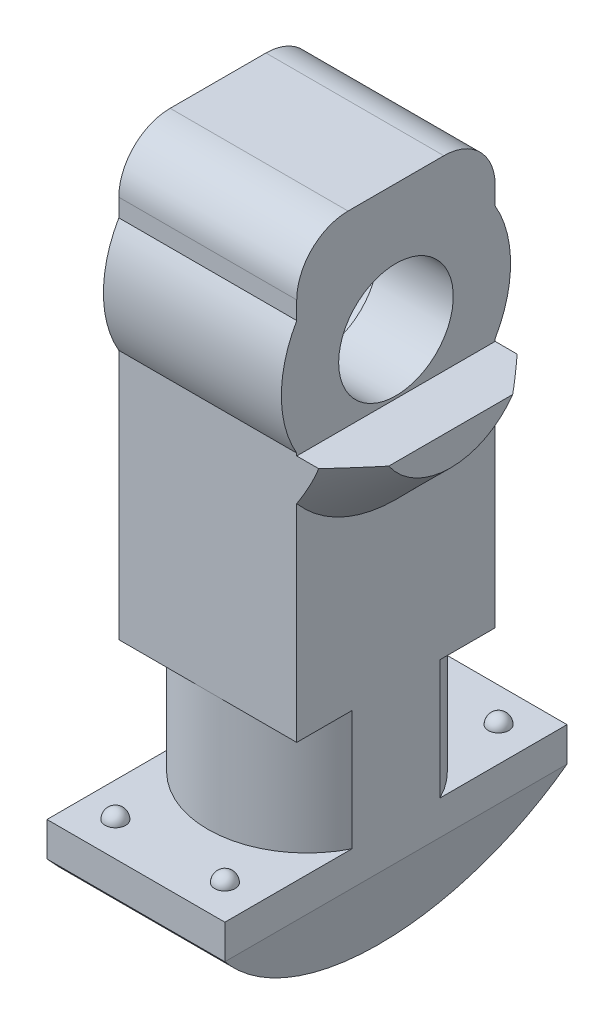
ISO-10303-21;
HEADER;
FILE_DESCRIPTION(('STEP AP214'),'2;1');
FILE_NAME('part.step','',(''),(''),'','','');
FILE_SCHEMA(('AUTOMOTIVE_DESIGN { 1 0 10303 214 1 1 1 1 }'));
ENDSEC;
DATA;
#1=APPLICATION_CONTEXT('core data for automotive mechanical design processes');
#2=APPLICATION_PROTOCOL_DEFINITION('international standard','automotive_design',2000,#1);
#3=PRODUCT_CONTEXT('',#1,'mechanical');
#4=PRODUCT('Part','Part','',(#3));
#5=PRODUCT_RELATED_PRODUCT_CATEGORY('part','',(#4));
#6=PRODUCT_DEFINITION_FORMATION('','',#4);
#7=PRODUCT_DEFINITION_CONTEXT('part definition',#1,'design');
#8=PRODUCT_DEFINITION('design','',#6,#7);
#9=PRODUCT_DEFINITION_SHAPE('','',#8);
#10=(LENGTH_UNIT() NAMED_UNIT(*) SI_UNIT(.MILLI.,.METRE.));
#11=(NAMED_UNIT(*) PLANE_ANGLE_UNIT() SI_UNIT($,.RADIAN.));
#12=(NAMED_UNIT(*) SI_UNIT($,.STERADIAN.) SOLID_ANGLE_UNIT());
#13=UNCERTAINTY_MEASURE_WITH_UNIT(LENGTH_MEASURE(1.E-05),#10,'distance_accuracy_value','');
#14=(GEOMETRIC_REPRESENTATION_CONTEXT(3) GLOBAL_UNCERTAINTY_ASSIGNED_CONTEXT((#13)) GLOBAL_UNIT_ASSIGNED_CONTEXT((#10,
#11,#12)) REPRESENTATION_CONTEXT('',''));
#15=CARTESIAN_POINT('',(0.,0.,0.));
#16=DIRECTION('',(0.,0.,1.));
#17=DIRECTION('',(1.,0.,0.));
#18=AXIS2_PLACEMENT_3D('',#15,#16,#17);
#19=CARTESIAN_POINT('',(1.6,-0.5,0.));
#20=DIRECTION('',(1.,0.,0.));
#21=DIRECTION('',(0.,0.,-1.));
#22=AXIS2_PLACEMENT_3D('',#19,#20,#21);
#23=PLANE('',#22);
#24=DIRECTION('',(0.,0.,-1.));
#25=VECTOR('',#24,1.);
#26=CARTESIAN_POINT('',(1.6,-1.75,2.9));
#27=LINE('',#26,#25);
#28=CARTESIAN_POINT('',(1.60000000000254,-1.75,-1.81038669903522));
#29=VERTEX_POINT('',#28);
#30=CARTESIAN_POINT('',(1.59999999999814,-1.75,1.81038669904057));
#31=VERTEX_POINT('',#30);
#32=EDGE_CURVE('E187',#29,#31,#27,.F.);
#33=ORIENTED_EDGE('',*,*,#32,.T.);
#34=CARTESIAN_POINT('',(1.59999999999627,-0.5,0.));
#35=DIRECTION('',(-1.,0.,0.));
#36=DIRECTION('',(0.,0.,1.));
#37=AXIS2_PLACEMENT_3D('',#34,#35,#36);
#38=CIRCLE('',#37,2.20000000001619);
#39=EDGE_CURVE('E178',#29,#31,#38,.T.);
#40=ORIENTED_EDGE('',*,*,#39,.F.);
#41=EDGE_LOOP('',(#33,#40));
#42=FACE_BOUND('',#41,.T.);
#43=ADVANCED_FACE('F17',(#42),#23,.T.);
#44=CARTESIAN_POINT('',(1.6,-1.75,2.9));
#45=DIRECTION('',(0.,-1.,0.));
#46=DIRECTION('',(0.,0.,-1.));
#47=AXIS2_PLACEMENT_3D('',#44,#45,#46);
#48=PLANE('',#47);
#49=CARTESIAN_POINT('',(0.642073467731171,-1.75000001399031,-2.90000001263299));
#50=CARTESIAN_POINT('',(0.723846884185271,-1.75000000501635,-2.81092434225716));
#51=CARTESIAN_POINT('',(0.805329764923846,-1.7500000013423,-2.72157806864586));
#52=CARTESIAN_POINT('',(0.967433883326548,-1.74999999865793,-2.54213578040048));
#53=CARTESIAN_POINT('',(1.04805526617478,-1.74999999964681,-2.452039896796));
#54=CARTESIAN_POINT('',(1.20819093168363,-1.75000000035322,-2.27085166426785));
#55=CARTESIAN_POINT('',(1.28770511803972,-1.75000000007065,-2.17975922987905));
#56=CARTESIAN_POINT('',(1.40581047909352,-1.74999999996467,-2.04210616649133));
#57=CARTESIAN_POINT('',(1.4449879173013,-1.74999999998233,-1.99604875672526));
#58=CARTESIAN_POINT('',(1.52286981599518,-1.75000000001767,-1.9035335259204));
#59=CARTESIAN_POINT('',(1.56157426161035,-1.75000000003533,-1.85707569237016));
#60=CARTESIAN_POINT('',(1.60000000000881,-1.75,-1.81038669902761));
#61=B_SPLINE_CURVE_WITH_KNOTS('',3,(#49,#50,#51,#52,#53,#54,#55,#56,#57,#58,#59,#60),
.UNSPECIFIED.,.F.,.F.,(4,2,2,2,2,4),(0.,0.36275997761386,0.725457825037964,1.08818702548766,
1.26958268894687,1.45098404090674),.UNSPECIFIED.);
#62=CARTESIAN_POINT('',(0.642073459544723,-1.7500000139962,-2.9));
#63=VERTEX_POINT('',#62);
#64=EDGE_CURVE('E188',#63,#29,#61,.T.);
#65=ORIENTED_EDGE('',*,*,#64,.F.);
#66=DIRECTION('',(1.,0.,0.));
#67=VECTOR('',#66,1.);
#68=CARTESIAN_POINT('',(1.6,-1.75,-2.9));
#69=LINE('',#68,#67);
#70=CARTESIAN_POINT('',(0.,-1.75,-2.9));
#71=VERTEX_POINT('',#70);
#72=EDGE_CURVE('E169',#71,#63,#69,.T.);
#73=ORIENTED_EDGE('',*,*,#72,.F.);
#74=DIRECTION('',(0.,0.,-1.));
#75=VECTOR('',#74,1.);
#76=CARTESIAN_POINT('',(0.,-1.75,0.));
#77=LINE('',#76,#75);
#78=CARTESIAN_POINT('',(0.,-1.75,2.9));
#79=VERTEX_POINT('',#78);
#80=EDGE_CURVE('E165',#79,#71,#77,.T.);
#81=ORIENTED_EDGE('',*,*,#80,.F.);
#82=DIRECTION('',(1.,0.,0.));
#83=VECTOR('',#82,1.);
#84=CARTESIAN_POINT('',(1.6,-1.75,2.9));
#85=LINE('',#84,#83);
#86=CARTESIAN_POINT('',(0.642073462542952,-1.75,2.90000000276796));
#87=VERTEX_POINT('',#86);
#88=EDGE_CURVE('E158',#87,#79,#85,.F.);
#89=ORIENTED_EDGE('',*,*,#88,.F.);
#90=CARTESIAN_POINT('',(1.60000000000881,-1.75,1.81038669902761));
#91=CARTESIAN_POINT('',(1.56157426157592,-1.75,1.85707569237032));
#92=CARTESIAN_POINT('',(1.52286981595552,-1.75,1.90353352594732));
#93=CARTESIAN_POINT('',(1.44498791725357,-1.75,1.99604875680214));
#94=CARTESIAN_POINT('',(1.405810479043,-1.75,2.04210616659145));
#95=CARTESIAN_POINT('',(1.28770511790387,-1.75,2.17975922995491));
#96=CARTESIAN_POINT('',(1.20819093137705,-1.75,2.27085166421588));
#97=CARTESIAN_POINT('',(1.04805526621256,-1.75,2.45203989715207));
#98=CARTESIAN_POINT('',(0.967433883879096,-1.75,2.54213578129214));
#99=CARTESIAN_POINT('',(0.805329763910076,-1.75,2.72157806826454));
#100=CARTESIAN_POINT('',(0.72384688108987,-1.75,2.81092434006677));
#101=CARTESIAN_POINT('',(0.64207345961535,-1.75,2.90000000595594));
#102=B_SPLINE_CURVE_WITH_KNOTS('',3,(#90,#91,#92,#93,#94,#95,#96,#97,#98,#99,#100,#101),
.UNSPECIFIED.,.F.,.F.,(4,2,2,2,2,4),(0.,0.181401352029868,0.362797015546221,0.725526216057333,
1.08822406362907,1.45098404143702),.UNSPECIFIED.);
#103=EDGE_CURVE('E162',#31,#87,#102,.T.);
#104=ORIENTED_EDGE('',*,*,#103,.F.);
#105=ORIENTED_EDGE('',*,*,#32,.F.);
#106=EDGE_LOOP('',(#65,#73,#81,#89,#104,#105));
#107=FACE_BOUND('',#106,.T.);
#108=ADVANCED_FACE('F161',(#107),#48,.F.);
#109=CARTESIAN_POINT('',(5.6843418860808E-11,-0.5,0.));
#110=DIRECTION('',(-1.,0.,0.));
#111=DIRECTION('',(0.,0.,1.));
#112=AXIS2_PLACEMENT_3D('',#109,#110,#111);
#113=CONICAL_SURFACE('',#112,3.79999999995562,0.785398163397448);
#114=ORIENTED_EDGE('',*,*,#39,.T.);
#115=ORIENTED_EDGE('',*,*,#103,.T.);
#116=CARTESIAN_POINT('',(0.642073454007845,-1.75000002798982,2.90000000000444));
#117=CARTESIAN_POINT('',(0.599984711568259,-1.85620460388867,2.9000000000016));
#118=CARTESIAN_POINT('',(0.554110767962301,-1.96080716149316,2.90000000000043));
#119=CARTESIAN_POINT('',(0.456326831215036,-2.16686486208564,2.89999999999957));
#120=CARTESIAN_POINT('',(0.404431349587173,-2.2683268550192,2.89999999999988));
#121=CARTESIAN_POINT('',(0.295963928441107,-2.46858969854984,2.90000000000012));
#122=CARTESIAN_POINT('',(0.239395242508375,-2.56739233815585,2.90000000000006));
#123=CARTESIAN_POINT('',(0.12236067384779,-2.7629860603877,2.89999999999994));
#124=CARTESIAN_POINT('',(0.0618859140923977,-2.85977184905979,2.89999999999988));
#125=CARTESIAN_POINT('',(7.32118330110463E-12,-2.95560583156969,2.9));
#126=B_SPLINE_CURVE_WITH_KNOTS('',3,(#116,#117,#118,#119,#120,#121,#122,#123,#124,#125),
.UNSPECIFIED.,.F.,.F.,(4,2,2,2,4),(0.,0.342512067190585,0.684215206787123,1.02568241849847,
1.36795499506395),.UNSPECIFIED.);
#127=CARTESIAN_POINT('',(3.66051245554286E-12,-2.95560583157535,2.9));
#128=VERTEX_POINT('',#127);
#129=EDGE_CURVE('E20',#87,#128,#126,.T.);
#130=ORIENTED_EDGE('',*,*,#129,.T.);
#131=CARTESIAN_POINT('',(0.,-0.5,0.));
#132=DIRECTION('',(-1.,0.,0.));
#133=DIRECTION('',(0.,0.,1.));
#134=AXIS2_PLACEMENT_3D('',#131,#132,#133);
#135=CIRCLE('',#134,3.80000000001246);
#136=CARTESIAN_POINT('',(3.65970185960833E-12,-2.95560583157535,-2.9));
#137=VERTEX_POINT('',#136);
#138=EDGE_CURVE('E277',#137,#128,#135,.T.);
#139=ORIENTED_EDGE('',*,*,#138,.F.);
#140=CARTESIAN_POINT('',(7.31948123185995E-12,-2.95560583156969,-2.9));
#141=CARTESIAN_POINT('',(0.0618859140922936,-2.85977184906005,-2.9));
#142=CARTESIAN_POINT('',(0.122360673847512,-2.76298606038819,-2.9));
#143=CARTESIAN_POINT('',(0.239395242507764,-2.56739233815683,-2.9));
#144=CARTESIAN_POINT('',(0.295963928440336,-2.46858969855109,-2.9));
#145=CARTESIAN_POINT('',(0.404431349586282,-2.26832685502102,-2.9));
#146=CARTESIAN_POINT('',(0.456326831214183,-2.16686486208778,-2.9));
#147=CARTESIAN_POINT('',(0.55411076796095,-1.96080716149565,-2.9));
#148=CARTESIAN_POINT('',(0.59998471156637,-1.85620460389121,-2.9));
#149=CARTESIAN_POINT('',(0.642073454004737,-1.7500000279921,-2.9));
#150=B_SPLINE_CURVE_WITH_KNOTS('',3,(#140,#141,#142,#143,#144,#145,#146,#147,#148,#149),
.UNSPECIFIED.,.F.,.F.,(4,2,2,2,4),(0.,0.342272576564626,0.683739788275075,1.02544292787079,
1.36795499506062),.UNSPECIFIED.);
#151=EDGE_CURVE('E186',#137,#63,#150,.T.);
#152=ORIENTED_EDGE('',*,*,#151,.T.);
#153=ORIENTED_EDGE('',*,*,#64,.T.);
#154=EDGE_LOOP('',(#114,#115,#130,#139,#152,#153));
#155=FACE_BOUND('',#154,.T.);
#156=ADVANCED_FACE('F173',(#155),#113,.T.);
#157=CARTESIAN_POINT('',(-0.488880091841035,-15.8,-5.));
#158=DIRECTION('',(-0.978147600733807,0.207911690817753,0.));
#159=DIRECTION('',(-0.207911690817753,-0.978147600733807,0.));
#160=AXIS2_PLACEMENT_3D('',#157,#158,#159);
#161=PLANE('',#160);
#162=CARTESIAN_POINT('',(0.910758658807827,-9.21521739130435,0.));
#163=DIRECTION('',(-0.978147600733807,0.207911690817753,0.));
#164=DIRECTION('',(0.207911690817753,0.978147600733807,0.));
#165=AXIS2_PLACEMENT_3D('',#162,#163,#164);
#166=ELLIPSE('',#165,6.73189056923081,6.58478260869566);
#167=CARTESIAN_POINT('',(0.,-13.5,-5.));
#168=VERTEX_POINT('',#167);
#169=CARTESIAN_POINT('',(0.,-13.5,5.));
#170=VERTEX_POINT('',#169);
#171=EDGE_CURVE('E272',#168,#170,#166,.T.);
#172=ORIENTED_EDGE('',*,*,#171,.F.);
#173=DIRECTION('',(0.,0.,-1.));
#174=VECTOR('',#173,1.);
#175=CARTESIAN_POINT('',(0.,-13.5,0.));
#176=LINE('',#175,#174);
#177=EDGE_CURVE('E194',#170,#168,#176,.T.);
#178=ORIENTED_EDGE('',*,*,#177,.F.);
#179=EDGE_LOOP('',(#172,#178));
#180=FACE_BOUND('',#179,.T.);
#181=ADVANCED_FACE('F299',(#180),#161,.F.);
#182=CARTESIAN_POINT('',(0.,0.,0.));
#183=DIRECTION('',(-1.,0.,0.));
#184=DIRECTION('',(0.,0.,1.));
#185=AXIS2_PLACEMENT_3D('',#182,#183,#184);
#186=CYLINDRICAL_SURFACE('',#185,1.675);
#187=CARTESIAN_POINT('',(0.,0.,0.));
#188=DIRECTION('',(-1.,0.,0.));
#189=DIRECTION('',(0.,0.,1.));
#190=AXIS2_PLACEMENT_3D('',#187,#188,#189);
#191=CIRCLE('',#190,1.675);
#192=CARTESIAN_POINT('',(0.,0.,1.675));
#193=VERTEX_POINT('',#192);
#194=EDGE_CURVE('E281',#193,#193,#191,.T.);
#195=ORIENTED_EDGE('',*,*,#194,.F.);
#196=EDGE_LOOP('',(#195));
#197=FACE_BOUND('',#196,.T.);
#198=CARTESIAN_POINT('',(-2.2,0.,0.));
#199=DIRECTION('',(-1.,0.,0.));
#200=DIRECTION('',(0.,0.,1.));
#201=AXIS2_PLACEMENT_3D('',#198,#199,#200);
#202=CIRCLE('',#201,1.675);
#203=CARTESIAN_POINT('',(-2.2,0.,1.675));
#204=VERTEX_POINT('',#203);
#205=EDGE_CURVE('E268',#204,#204,#202,.T.);
#206=ORIENTED_EDGE('',*,*,#205,.T.);
#207=EDGE_LOOP('',(#206));
#208=FACE_BOUND('',#207,.T.);
#209=ADVANCED_FACE('F461',(#197,#208),#186,.F.);
#210=CARTESIAN_POINT('',(-1.,-12.5,-4.));
#211=DIRECTION('',(0.,0.,-1.));
#212=DIRECTION('',(1.,0.,0.));
#213=AXIS2_PLACEMENT_3D('',#210,#211,#212);
#214=SPHERICAL_SURFACE('',#213,0.3);
#215=CARTESIAN_POINT('',(-1.,-12.5,-4.));
#216=DIRECTION('',(0.,1.,0.));
#217=DIRECTION('',(0.,0.,-1.));
#218=AXIS2_PLACEMENT_3D('',#215,#216,#217);
#219=CIRCLE('',#218,0.3);
#220=CARTESIAN_POINT('',(-1.,-12.5,-3.7));
#221=VERTEX_POINT('',#220);
#222=CARTESIAN_POINT('',(-1.,-12.5,-4.3));
#223=VERTEX_POINT('',#222);
#224=EDGE_CURVE('E266',#221,#223,#219,.F.);
#225=ORIENTED_EDGE('',*,*,#224,.F.);
#226=CARTESIAN_POINT('',(-1.,-12.5,-4.));
#227=DIRECTION('',(0.,-1.,0.));
#228=DIRECTION('',(0.,0.,-1.));
#229=AXIS2_PLACEMENT_3D('',#226,#227,#228);
#230=CIRCLE('',#229,0.3);
#231=EDGE_CURVE('E263',#223,#221,#230,.T.);
#232=ORIENTED_EDGE('',*,*,#231,.F.);
#233=EDGE_LOOP('',(#225,#232));
#234=FACE_BOUND('',#233,.T.);
#235=ADVANCED_FACE('F459',(#234),#214,.T.);
#236=CARTESIAN_POINT('',(-5.2,-12.5,-5.));
#237=DIRECTION('',(0.,0.,-1.));
#238=DIRECTION('',(0.,1.,0.));
#239=AXIS2_PLACEMENT_3D('',#236,#237,#238);
#240=PLANE('',#239);
#241=DIRECTION('',(0.,1.,0.));
#242=VECTOR('',#241,1.);
#243=CARTESIAN_POINT('',(-5.2,-12.5,-5.));
#244=LINE('',#243,#242);
#245=CARTESIAN_POINT('',(-5.2,-13.5,-5.));
#246=VERTEX_POINT('',#245);
#247=CARTESIAN_POINT('',(-5.2,-12.5,-5.));
#248=VERTEX_POINT('',#247);
#249=EDGE_CURVE('E41',#246,#248,#244,.T.);
#250=ORIENTED_EDGE('',*,*,#249,.T.);
#251=DIRECTION('',(1.,0.,0.));
#252=VECTOR('',#251,1.);
#253=CARTESIAN_POINT('',(-5.2,-12.5,-5.));
#254=LINE('',#253,#252);
#255=CARTESIAN_POINT('',(0.,-12.5,-5.));
#256=VERTEX_POINT('',#255);
#257=EDGE_CURVE('E262',#256,#248,#254,.F.);
#258=ORIENTED_EDGE('',*,*,#257,.F.);
#259=DIRECTION('',(0.,1.,0.));
#260=VECTOR('',#259,1.);
#261=CARTESIAN_POINT('',(0.,-9.21521739130435,-5.));
#262=LINE('',#261,#260);
#263=EDGE_CURVE('E456',#168,#256,#262,.T.);
#264=ORIENTED_EDGE('',*,*,#263,.F.);
#265=DIRECTION('',(1.,0.,0.));
#266=VECTOR('',#265,1.);
#267=CARTESIAN_POINT('',(-5.2,-13.5,-5.));
#268=LINE('',#267,#266);
#269=EDGE_CURVE('E271',#246,#168,#268,.T.);
#270=ORIENTED_EDGE('',*,*,#269,.F.);
#271=EDGE_LOOP('',(#250,#258,#264,#270));
#272=FACE_BOUND('',#271,.T.);
#273=ADVANCED_FACE('F446',(#272),#240,.T.);
#274=CARTESIAN_POINT('',(-4.2,-12.5,-4.));
#275=DIRECTION('',(0.,0.,-1.));
#276=DIRECTION('',(1.,0.,0.));
#277=AXIS2_PLACEMENT_3D('',#274,#275,#276);
#278=SPHERICAL_SURFACE('',#277,0.3);
#279=CARTESIAN_POINT('',(-4.2,-12.5,-4.));
#280=DIRECTION('',(0.,1.,0.));
#281=DIRECTION('',(0.,0.,-1.));
#282=AXIS2_PLACEMENT_3D('',#279,#280,#281);
#283=CIRCLE('',#282,0.3);
#284=CARTESIAN_POINT('',(-4.2,-12.5,-3.7));
#285=VERTEX_POINT('',#284);
#286=CARTESIAN_POINT('',(-4.2,-12.5,-4.3));
#287=VERTEX_POINT('',#286);
#288=EDGE_CURVE('E260',#285,#287,#283,.F.);
#289=ORIENTED_EDGE('',*,*,#288,.F.);
#290=CARTESIAN_POINT('',(-4.2,-12.5,-4.));
#291=DIRECTION('',(0.,-1.,0.));
#292=DIRECTION('',(0.,0.,-1.));
#293=AXIS2_PLACEMENT_3D('',#290,#291,#292);
#294=CIRCLE('',#293,0.3);
#295=EDGE_CURVE('E258',#287,#285,#294,.T.);
#296=ORIENTED_EDGE('',*,*,#295,.F.);
#297=EDGE_LOOP('',(#289,#296));
#298=FACE_BOUND('',#297,.T.);
#299=ADVANCED_FACE('F441',(#298),#278,.T.);
#300=CARTESIAN_POINT('',(-2.6,-9.,0.));
#301=DIRECTION('',(0.,1.,0.));
#302=DIRECTION('',(0.,0.,1.));
#303=AXIS2_PLACEMENT_3D('',#300,#301,#302);
#304=PLANE('',#303);
#305=DIRECTION('',(0.,0.,-1.));
#306=VECTOR('',#305,1.);
#307=CARTESIAN_POINT('',(0.,-9.,0.));
#308=LINE('',#307,#306);
#309=CARTESIAN_POINT('',(0.,-9.,-1.28452325786651));
#310=VERTEX_POINT('',#309);
#311=CARTESIAN_POINT('',(0.,-9.,-2.9));
#312=VERTEX_POINT('',#311);
#313=EDGE_CURVE('E280',#310,#312,#308,.T.);
#314=ORIENTED_EDGE('',*,*,#313,.F.);
#315=CARTESIAN_POINT('',(-2.6,-9.,0.));
#316=DIRECTION('',(0.,-1.,0.));
#317=DIRECTION('',(0.,0.,-1.));
#318=AXIS2_PLACEMENT_3D('',#315,#316,#317);
#319=CIRCLE('',#318,2.9);
#320=CARTESIAN_POINT('',(-2.6,-9.,-2.9));
#321=VERTEX_POINT('',#320);
#322=EDGE_CURVE('E286',#321,#310,#319,.T.);
#323=ORIENTED_EDGE('',*,*,#322,.F.);
#324=DIRECTION('',(1.,0.,0.));
#325=VECTOR('',#324,1.);
#326=CARTESIAN_POINT('',(-5.2,-9.,-2.9));
#327=LINE('',#326,#325);
#328=EDGE_CURVE('E512',#312,#321,#327,.F.);
#329=ORIENTED_EDGE('',*,*,#328,.F.);
#330=EDGE_LOOP('',(#314,#323,#329));
#331=FACE_BOUND('',#330,.T.);
#332=ADVANCED_FACE('F437',(#331),#304,.F.);
#333=CARTESIAN_POINT('',(-2.6,-9.,0.));
#334=DIRECTION('',(0.,1.,0.));
#335=DIRECTION('',(0.,0.,1.));
#336=AXIS2_PLACEMENT_3D('',#333,#334,#335);
#337=PLANE('',#336);
#338=CARTESIAN_POINT('',(-2.6,-9.,0.));
#339=DIRECTION('',(0.,-1.,0.));
#340=DIRECTION('',(0.,0.,-1.));
#341=AXIS2_PLACEMENT_3D('',#338,#339,#340);
#342=CIRCLE('',#341,2.9);
#343=CARTESIAN_POINT('',(-5.2,-9.,-1.28452325786651));
#344=VERTEX_POINT('',#343);
#345=EDGE_CURVE('E255',#344,#321,#342,.T.);
#346=ORIENTED_EDGE('',*,*,#345,.F.);
#347=DIRECTION('',(0.,0.,1.));
#348=VECTOR('',#347,1.);
#349=CARTESIAN_POINT('',(-5.2,-9.,0.));
#350=LINE('',#349,#348);
#351=CARTESIAN_POINT('',(-5.2,-9.,-2.9));
#352=VERTEX_POINT('',#351);
#353=EDGE_CURVE('E288',#352,#344,#350,.T.);
#354=ORIENTED_EDGE('',*,*,#353,.F.);
#355=DIRECTION('',(1.,0.,0.));
#356=VECTOR('',#355,1.);
#357=CARTESIAN_POINT('',(-5.2,-9.,-2.9));
#358=LINE('',#357,#356);
#359=EDGE_CURVE('E513',#321,#352,#358,.F.);
#360=ORIENTED_EDGE('',*,*,#359,.F.);
#361=EDGE_LOOP('',(#346,#354,#360));
#362=FACE_BOUND('',#361,.T.);
#363=ADVANCED_FACE('F433',(#362),#337,.F.);
#364=CARTESIAN_POINT('',(-5.2,1.67705098312484,-2.9));
#365=DIRECTION('',(0.,0.,-1.));
#366=DIRECTION('',(0.,1.,0.));
#367=AXIS2_PLACEMENT_3D('',#364,#365,#366);
#368=PLANE('',#367);
#369=DIRECTION('',(0.,1.,0.));
#370=VECTOR('',#369,1.);
#371=CARTESIAN_POINT('',(0.,-9.21521739130435,-2.9));
#372=LINE('',#371,#370);
#373=CARTESIAN_POINT('',(0.,1.67705098312484,-2.9));
#374=VERTEX_POINT('',#373);
#375=CARTESIAN_POINT('',(0.,2.2,-2.9));
#376=VERTEX_POINT('',#375);
#377=EDGE_CURVE('E584',#374,#376,#372,.T.);
#378=ORIENTED_EDGE('',*,*,#377,.F.);
#379=DIRECTION('',(1.,0.,0.));
#380=VECTOR('',#379,1.);
#381=CARTESIAN_POINT('',(-5.2,1.67705098312484,-2.9));
#382=LINE('',#381,#380);
#383=CARTESIAN_POINT('',(-5.2,1.67705098312484,-2.9));
#384=VERTEX_POINT('',#383);
#385=EDGE_CURVE('E251',#384,#374,#382,.T.);
#386=ORIENTED_EDGE('',*,*,#385,.F.);
#387=DIRECTION('',(0.,1.,0.));
#388=VECTOR('',#387,1.);
#389=CARTESIAN_POINT('',(-5.2,1.67705098312484,-2.9));
#390=LINE('',#389,#388);
#391=CARTESIAN_POINT('',(-5.2,2.2,-2.9));
#392=VERTEX_POINT('',#391);
#393=EDGE_CURVE('E586',#384,#392,#390,.T.);
#394=ORIENTED_EDGE('',*,*,#393,.T.);
#395=DIRECTION('',(1.,0.,0.));
#396=VECTOR('',#395,1.);
#397=CARTESIAN_POINT('',(-5.2,2.2,-2.9));
#398=LINE('',#397,#396);
#399=EDGE_CURVE('E248',#376,#392,#398,.F.);
#400=ORIENTED_EDGE('',*,*,#399,.F.);
#401=EDGE_LOOP('',(#378,#386,#394,#400));
#402=FACE_BOUND('',#401,.T.);
#403=ADVANCED_FACE('F429',(#402),#368,.T.);
#404=CARTESIAN_POINT('',(0.,-9.21521739130435,0.));
#405=DIRECTION('',(1.,0.,0.));
#406=DIRECTION('',(0.,0.,-1.));
#407=AXIS2_PLACEMENT_3D('',#404,#405,#406);
#408=PLANE('',#407);
#409=ORIENTED_EDGE('',*,*,#194,.T.);
#410=EDGE_LOOP('',(#409));
#411=FACE_BOUND('',#410,.T.);
#412=CARTESIAN_POINT('',(0.,0.,0.));
#413=DIRECTION('',(1.,0.,0.));
#414=DIRECTION('',(0.,0.,-1.));
#415=AXIS2_PLACEMENT_3D('',#412,#413,#414);
#416=CIRCLE('',#415,3.35);
#417=CARTESIAN_POINT('',(0.,-1.67705098312484,2.9));
#418=VERTEX_POINT('',#417);
#419=CARTESIAN_POINT('',(0.,1.67705098312484,2.9));
#420=VERTEX_POINT('',#419);
#421=EDGE_CURVE('E238',#418,#420,#416,.F.);
#422=ORIENTED_EDGE('',*,*,#421,.F.);
#423=DIRECTION('',(0.,1.,0.));
#424=VECTOR('',#423,1.);
#425=CARTESIAN_POINT('',(0.,-9.21521739130435,2.9));
#426=LINE('',#425,#424);
#427=EDGE_CURVE('E285',#418,#79,#426,.F.);
#428=ORIENTED_EDGE('',*,*,#427,.T.);
#429=ORIENTED_EDGE('',*,*,#80,.T.);
#430=DIRECTION('',(0.,1.,0.));
#431=VECTOR('',#430,1.);
#432=CARTESIAN_POINT('',(0.,-12.5,-2.9));
#433=LINE('',#432,#431);
#434=CARTESIAN_POINT('',(0.,-1.67705098312484,-2.9));
#435=VERTEX_POINT('',#434);
#436=EDGE_CURVE('E509',#435,#71,#433,.F.);
#437=ORIENTED_EDGE('',*,*,#436,.F.);
#438=CARTESIAN_POINT('',(0.,0.,0.));
#439=DIRECTION('',(1.,0.,0.));
#440=DIRECTION('',(0.,0.,-1.));
#441=AXIS2_PLACEMENT_3D('',#438,#439,#440);
#442=CIRCLE('',#441,3.35);
#443=EDGE_CURVE('E249',#374,#435,#442,.F.);
#444=ORIENTED_EDGE('',*,*,#443,.F.);
#445=ORIENTED_EDGE('',*,*,#377,.T.);
#446=CARTESIAN_POINT('',(0.,2.2,-1.4));
#447=DIRECTION('',(1.,0.,0.));
#448=DIRECTION('',(0.,0.,-1.));
#449=AXIS2_PLACEMENT_3D('',#446,#447,#448);
#450=CIRCLE('',#449,1.5);
#451=CARTESIAN_POINT('',(0.,3.7,-1.4));
#452=VERTEX_POINT('',#451);
#453=EDGE_CURVE('E245',#452,#376,#450,.F.);
#454=ORIENTED_EDGE('',*,*,#453,.F.);
#455=DIRECTION('',(0.,0.,1.));
#456=VECTOR('',#455,1.);
#457=CARTESIAN_POINT('',(0.,3.7,-2.9));
#458=LINE('',#457,#456);
#459=CARTESIAN_POINT('',(0.,3.7,1.4));
#460=VERTEX_POINT('',#459);
#461=EDGE_CURVE('E502',#460,#452,#458,.F.);
#462=ORIENTED_EDGE('',*,*,#461,.F.);
#463=CARTESIAN_POINT('',(0.,2.2,1.4));
#464=DIRECTION('',(1.,0.,0.));
#465=DIRECTION('',(0.,0.,-1.));
#466=AXIS2_PLACEMENT_3D('',#463,#464,#465);
#467=CIRCLE('',#466,1.5);
#468=CARTESIAN_POINT('',(0.,2.2,2.9));
#469=VERTEX_POINT('',#468);
#470=EDGE_CURVE('E242',#469,#460,#467,.F.);
#471=ORIENTED_EDGE('',*,*,#470,.F.);
#472=DIRECTION('',(0.,1.,0.));
#473=VECTOR('',#472,1.);
#474=CARTESIAN_POINT('',(0.,1.67705098312484,2.9));
#475=LINE('',#474,#473);
#476=EDGE_CURVE('E284',#420,#469,#475,.T.);
#477=ORIENTED_EDGE('',*,*,#476,.F.);
#478=EDGE_LOOP('',(#422,#428,#429,#437,#444,#445,#454,#462,#471,#477));
#479=FACE_BOUND('',#478,.T.);
#480=ADVANCED_FACE('F425',(#411,#479),#408,.T.);
#481=CARTESIAN_POINT('',(-5.2,1.67705098312484,2.9));
#482=DIRECTION('',(0.,0.,1.));
#483=DIRECTION('',(1.,0.,0.));
#484=AXIS2_PLACEMENT_3D('',#481,#482,#483);
#485=PLANE('',#484);
#486=DIRECTION('',(0.,1.,0.));
#487=VECTOR('',#486,1.);
#488=CARTESIAN_POINT('',(-5.2,1.67705098312484,2.9));
#489=LINE('',#488,#487);
#490=CARTESIAN_POINT('',(-5.2,2.2,2.9));
#491=VERTEX_POINT('',#490);
#492=CARTESIAN_POINT('',(-5.2,1.67705098312484,2.9));
#493=VERTEX_POINT('',#492);
#494=EDGE_CURVE('E561',#491,#493,#489,.F.);
#495=ORIENTED_EDGE('',*,*,#494,.T.);
#496=DIRECTION('',(1.,0.,0.));
#497=VECTOR('',#496,1.);
#498=CARTESIAN_POINT('',(-5.2,1.67705098312484,2.9));
#499=LINE('',#498,#497);
#500=EDGE_CURVE('E240',#420,#493,#499,.F.);
#501=ORIENTED_EDGE('',*,*,#500,.F.);
#502=ORIENTED_EDGE('',*,*,#476,.T.);
#503=DIRECTION('',(1.,0.,0.));
#504=VECTOR('',#503,1.);
#505=CARTESIAN_POINT('',(-5.2,2.2,2.9));
#506=LINE('',#505,#504);
#507=EDGE_CURVE('E244',#491,#469,#506,.T.);
#508=ORIENTED_EDGE('',*,*,#507,.F.);
#509=EDGE_LOOP('',(#495,#501,#502,#508));
#510=FACE_BOUND('',#509,.T.);
#511=ADVANCED_FACE('F421',(#510),#485,.T.);
#512=CARTESIAN_POINT('',(-2.6,-9.,0.));
#513=DIRECTION('',(0.,1.,0.));
#514=DIRECTION('',(0.,0.,1.));
#515=AXIS2_PLACEMENT_3D('',#512,#513,#514);
#516=PLANE('',#515);
#517=CARTESIAN_POINT('',(-2.6,-9.,0.));
#518=DIRECTION('',(0.,-1.,0.));
#519=DIRECTION('',(0.,0.,-1.));
#520=AXIS2_PLACEMENT_3D('',#517,#518,#519);
#521=CIRCLE('',#520,2.9);
#522=CARTESIAN_POINT('',(0.,-9.,1.28452325786651));
#523=VERTEX_POINT('',#522);
#524=CARTESIAN_POINT('',(-2.6,-9.,2.9));
#525=VERTEX_POINT('',#524);
#526=EDGE_CURVE('E234',#523,#525,#521,.T.);
#527=ORIENTED_EDGE('',*,*,#526,.F.);
#528=DIRECTION('',(0.,0.,-1.));
#529=VECTOR('',#528,1.);
#530=CARTESIAN_POINT('',(0.,-9.,0.));
#531=LINE('',#530,#529);
#532=CARTESIAN_POINT('',(0.,-9.,2.9));
#533=VERTEX_POINT('',#532);
#534=EDGE_CURVE('E279',#533,#523,#531,.T.);
#535=ORIENTED_EDGE('',*,*,#534,.F.);
#536=DIRECTION('',(1.,0.,0.));
#537=VECTOR('',#536,1.);
#538=CARTESIAN_POINT('',(-5.2,-9.,2.9));
#539=LINE('',#538,#537);
#540=EDGE_CURVE('E403',#525,#533,#539,.T.);
#541=ORIENTED_EDGE('',*,*,#540,.F.);
#542=EDGE_LOOP('',(#527,#535,#541));
#543=FACE_BOUND('',#542,.T.);
#544=ADVANCED_FACE('F417',(#543),#516,.F.);
#545=CARTESIAN_POINT('',(-2.6,-9.,0.));
#546=DIRECTION('',(0.,1.,0.));
#547=DIRECTION('',(0.,0.,1.));
#548=AXIS2_PLACEMENT_3D('',#545,#546,#547);
#549=PLANE('',#548);
#550=DIRECTION('',(1.,0.,0.));
#551=VECTOR('',#550,1.);
#552=CARTESIAN_POINT('',(-5.2,-9.,2.9));
#553=LINE('',#552,#551);
#554=CARTESIAN_POINT('',(-5.2,-9.,2.9));
#555=VERTEX_POINT('',#554);
#556=EDGE_CURVE('E488',#555,#525,#553,.T.);
#557=ORIENTED_EDGE('',*,*,#556,.F.);
#558=DIRECTION('',(0.,0.,1.));
#559=VECTOR('',#558,1.);
#560=CARTESIAN_POINT('',(-5.2,-9.,0.));
#561=LINE('',#560,#559);
#562=CARTESIAN_POINT('',(-5.2,-9.,1.28452325786651));
#563=VERTEX_POINT('',#562);
#564=EDGE_CURVE('E406',#563,#555,#561,.T.);
#565=ORIENTED_EDGE('',*,*,#564,.F.);
#566=CARTESIAN_POINT('',(-2.6,-9.,0.));
#567=DIRECTION('',(0.,-1.,0.));
#568=DIRECTION('',(0.,0.,-1.));
#569=AXIS2_PLACEMENT_3D('',#566,#567,#568);
#570=CIRCLE('',#569,2.9);
#571=EDGE_CURVE('E231',#525,#563,#570,.T.);
#572=ORIENTED_EDGE('',*,*,#571,.F.);
#573=EDGE_LOOP('',(#557,#565,#572));
#574=FACE_BOUND('',#573,.T.);
#575=ADVANCED_FACE('F413',(#574),#549,.F.);
#576=CARTESIAN_POINT('',(-1.,-12.5,4.));
#577=DIRECTION('',(0.,0.,-1.));
#578=DIRECTION('',(1.,0.,0.));
#579=AXIS2_PLACEMENT_3D('',#576,#577,#578);
#580=SPHERICAL_SURFACE('',#579,0.3);
#581=CARTESIAN_POINT('',(-1.,-12.5,4.));
#582=DIRECTION('',(0.,1.,0.));
#583=DIRECTION('',(0.,0.,-1.));
#584=AXIS2_PLACEMENT_3D('',#581,#582,#583);
#585=CIRCLE('',#584,0.3);
#586=CARTESIAN_POINT('',(-1.,-12.5,4.3));
#587=VERTEX_POINT('',#586);
#588=CARTESIAN_POINT('',(-1.,-12.5,3.7));
#589=VERTEX_POINT('',#588);
#590=EDGE_CURVE('E229',#587,#589,#585,.F.);
#591=ORIENTED_EDGE('',*,*,#590,.F.);
#592=CARTESIAN_POINT('',(-1.,-12.5,4.));
#593=DIRECTION('',(0.,-1.,0.));
#594=DIRECTION('',(0.,0.,-1.));
#595=AXIS2_PLACEMENT_3D('',#592,#593,#594);
#596=CIRCLE('',#595,0.3);
#597=EDGE_CURVE('E227',#589,#587,#596,.T.);
#598=ORIENTED_EDGE('',*,*,#597,.F.);
#599=EDGE_LOOP('',(#591,#598));
#600=FACE_BOUND('',#599,.T.);
#601=ADVANCED_FACE('F409',(#600),#580,.T.);
#602=CARTESIAN_POINT('',(0.,-9.21521739130435,0.));
#603=DIRECTION('',(1.,0.,0.));
#604=DIRECTION('',(0.,0.,-1.));
#605=AXIS2_PLACEMENT_3D('',#602,#603,#604);
#606=PLANE('',#605);
#607=DIRECTION('',(0.,0.,1.));
#608=VECTOR('',#607,1.);
#609=CARTESIAN_POINT('',(0.,-12.5,2.9));
#610=LINE('',#609,#608);
#611=CARTESIAN_POINT('',(0.,-12.5,5.));
#612=VERTEX_POINT('',#611);
#613=CARTESIAN_POINT('',(0.,-12.5,1.28452325786651));
#614=VERTEX_POINT('',#613);
#615=EDGE_CURVE('E226',#612,#614,#610,.F.);
#616=ORIENTED_EDGE('',*,*,#615,.F.);
#617=DIRECTION('',(0.,-1.,0.));
#618=VECTOR('',#617,1.);
#619=CARTESIAN_POINT('',(0.,-12.5,5.));
#620=LINE('',#619,#618);
#621=EDGE_CURVE('E398',#170,#612,#620,.F.);
#622=ORIENTED_EDGE('',*,*,#621,.F.);
#623=ORIENTED_EDGE('',*,*,#177,.T.);
#624=ORIENTED_EDGE('',*,*,#263,.T.);
#625=DIRECTION('',(0.,0.,1.));
#626=VECTOR('',#625,1.);
#627=CARTESIAN_POINT('',(0.,-12.5,-5.));
#628=LINE('',#627,#626);
#629=CARTESIAN_POINT('',(0.,-12.5,-1.28452325786651));
#630=VERTEX_POINT('',#629);
#631=EDGE_CURVE('E265',#630,#256,#628,.F.);
#632=ORIENTED_EDGE('',*,*,#631,.F.);
#633=DIRECTION('',(0.,1.,0.));
#634=VECTOR('',#633,1.);
#635=CARTESIAN_POINT('',(0.,-9.21521739130435,-1.28452325786651));
#636=LINE('',#635,#634);
#637=EDGE_CURVE('E454',#630,#310,#636,.T.);
#638=ORIENTED_EDGE('',*,*,#637,.T.);
#639=ORIENTED_EDGE('',*,*,#313,.T.);
#640=DIRECTION('',(0.,1.,0.));
#641=VECTOR('',#640,1.);
#642=CARTESIAN_POINT('',(0.,-12.5,-2.9));
#643=LINE('',#642,#641);
#644=EDGE_CURVE('E254',#137,#312,#643,.F.);
#645=ORIENTED_EDGE('',*,*,#644,.F.);
#646=ORIENTED_EDGE('',*,*,#138,.T.);
#647=DIRECTION('',(0.,1.,0.));
#648=VECTOR('',#647,1.);
#649=CARTESIAN_POINT('',(0.,-12.5,2.9));
#650=LINE('',#649,#648);
#651=EDGE_CURVE('E185',#533,#128,#650,.T.);
#652=ORIENTED_EDGE('',*,*,#651,.F.);
#653=ORIENTED_EDGE('',*,*,#534,.T.);
#654=DIRECTION('',(0.,-1.,0.));
#655=VECTOR('',#654,1.);
#656=CARTESIAN_POINT('',(0.,-9.,1.28452325786651));
#657=LINE('',#656,#655);
#658=EDGE_CURVE('E237',#614,#523,#657,.F.);
#659=ORIENTED_EDGE('',*,*,#658,.F.);
#660=EDGE_LOOP('',(#616,#622,#623,#624,#632,#638,#639,#645,#646,#652,#653,#659));
#661=FACE_BOUND('',#660,.T.);
#662=ADVANCED_FACE('F412',(#661),#606,.T.);
#663=CARTESIAN_POINT('',(-5.2,-12.5,5.));
#664=DIRECTION('',(0.,0.,1.));
#665=DIRECTION('',(0.,-1.,0.));
#666=AXIS2_PLACEMENT_3D('',#663,#664,#665);
#667=PLANE('',#666);
#668=DIRECTION('',(0.,-1.,0.));
#669=VECTOR('',#668,1.);
#670=CARTESIAN_POINT('',(-5.2,-12.5,5.));
#671=LINE('',#670,#669);
#672=CARTESIAN_POINT('',(-5.2,-12.5,5.));
#673=VERTEX_POINT('',#672);
#674=CARTESIAN_POINT('',(-5.2,-13.5,5.));
#675=VERTEX_POINT('',#674);
#676=EDGE_CURVE('E276',#673,#675,#671,.T.);
#677=ORIENTED_EDGE('',*,*,#676,.T.);
#678=DIRECTION('',(1.,0.,0.));
#679=VECTOR('',#678,1.);
#680=CARTESIAN_POINT('',(-5.2,-13.5,5.));
#681=LINE('',#680,#679);
#682=EDGE_CURVE('E275',#170,#675,#681,.F.);
#683=ORIENTED_EDGE('',*,*,#682,.F.);
#684=ORIENTED_EDGE('',*,*,#621,.T.);
#685=DIRECTION('',(1.,0.,0.));
#686=VECTOR('',#685,1.);
#687=CARTESIAN_POINT('',(-5.2,-12.5,5.));
#688=LINE('',#687,#686);
#689=EDGE_CURVE('E223',#673,#612,#688,.T.);
#690=ORIENTED_EDGE('',*,*,#689,.F.);
#691=EDGE_LOOP('',(#677,#683,#684,#690));
#692=FACE_BOUND('',#691,.T.);
#693=ADVANCED_FACE('F390',(#692),#667,.T.);
#694=CARTESIAN_POINT('',(-4.2,-12.5,4.));
#695=DIRECTION('',(0.,0.,-1.));
#696=DIRECTION('',(1.,0.,0.));
#697=AXIS2_PLACEMENT_3D('',#694,#695,#696);
#698=SPHERICAL_SURFACE('',#697,0.3);
#699=CARTESIAN_POINT('',(-4.2,-12.5,4.));
#700=DIRECTION('',(0.,1.,0.));
#701=DIRECTION('',(0.,0.,-1.));
#702=AXIS2_PLACEMENT_3D('',#699,#700,#701);
#703=CIRCLE('',#702,0.3);
#704=CARTESIAN_POINT('',(-4.2,-12.5,4.3));
#705=VERTEX_POINT('',#704);
#706=CARTESIAN_POINT('',(-4.2,-12.5,3.7));
#707=VERTEX_POINT('',#706);
#708=EDGE_CURVE('E221',#705,#707,#703,.F.);
#709=ORIENTED_EDGE('',*,*,#708,.F.);
#710=CARTESIAN_POINT('',(-4.2,-12.5,4.));
#711=DIRECTION('',(0.,-1.,0.));
#712=DIRECTION('',(0.,0.,-1.));
#713=AXIS2_PLACEMENT_3D('',#710,#711,#712);
#714=CIRCLE('',#713,0.3);
#715=EDGE_CURVE('E219',#707,#705,#714,.T.);
#716=ORIENTED_EDGE('',*,*,#715,.F.);
#717=EDGE_LOOP('',(#709,#716));
#718=FACE_BOUND('',#717,.T.);
#719=ADVANCED_FACE('F385',(#718),#698,.T.);
#720=CARTESIAN_POINT('',(-5.2,-9.21521739130435,0.));
#721=DIRECTION('',(1.,0.,0.));
#722=DIRECTION('',(0.,0.,-1.));
#723=AXIS2_PLACEMENT_3D('',#720,#721,#722);
#724=CYLINDRICAL_SURFACE('',#723,6.58478260869566);
#725=CARTESIAN_POINT('',(-6.11075865880783,-9.21521739130435,0.));
#726=DIRECTION('',(0.978147600733807,0.207911690817753,0.));
#727=DIRECTION('',(0.207911690817753,-0.978147600733807,0.));
#728=AXIS2_PLACEMENT_3D('',#725,#726,#727);
#729=ELLIPSE('',#728,6.73189056923081,6.58478260869566);
#730=EDGE_CURVE('E216',#675,#246,#729,.T.);
#731=ORIENTED_EDGE('',*,*,#730,.T.);
#732=ORIENTED_EDGE('',*,*,#269,.T.);
#733=ORIENTED_EDGE('',*,*,#171,.T.);
#734=ORIENTED_EDGE('',*,*,#682,.T.);
#735=EDGE_LOOP('',(#731,#732,#733,#734));
#736=FACE_BOUND('',#735,.T.);
#737=ADVANCED_FACE('F381',(#736),#724,.T.);
#738=CARTESIAN_POINT('',(-2.2,0.,0.));
#739=DIRECTION('',(1.,0.,0.));
#740=DIRECTION('',(0.,0.,-1.));
#741=AXIS2_PLACEMENT_3D('',#738,#739,#740);
#742=PLANE('',#741);
#743=ORIENTED_EDGE('',*,*,#205,.F.);
#744=EDGE_LOOP('',(#743));
#745=FACE_BOUND('',#744,.T.);
#746=CARTESIAN_POINT('',(-2.2,0.,0.));
#747=DIRECTION('',(-1.,0.,0.));
#748=DIRECTION('',(0.,0.,1.));
#749=AXIS2_PLACEMENT_3D('',#746,#747,#748);
#750=CIRCLE('',#749,2.85);
#751=CARTESIAN_POINT('',(-2.2,0.,2.85));
#752=VERTEX_POINT('',#751);
#753=EDGE_CURVE('E212',#752,#752,#750,.T.);
#754=ORIENTED_EDGE('',*,*,#753,.T.);
#755=EDGE_LOOP('',(#754));
#756=FACE_BOUND('',#755,.T.);
#757=ADVANCED_FACE('F377',(#745,#756),#742,.F.);
#758=CARTESIAN_POINT('',(-5.2,-12.5,-5.));
#759=DIRECTION('',(0.,1.,0.));
#760=DIRECTION('',(0.,0.,1.));
#761=AXIS2_PLACEMENT_3D('',#758,#759,#760);
#762=PLANE('',#761);
#763=ORIENTED_EDGE('',*,*,#288,.T.);
#764=ORIENTED_EDGE('',*,*,#295,.T.);
#765=EDGE_LOOP('',(#763,#764));
#766=FACE_BOUND('',#765,.T.);
#767=CARTESIAN_POINT('',(-2.6,-12.5,0.));
#768=DIRECTION('',(0.,-1.,0.));
#769=DIRECTION('',(0.,0.,-1.));
#770=AXIS2_PLACEMENT_3D('',#767,#768,#769);
#771=CIRCLE('',#770,2.9);
#772=CARTESIAN_POINT('',(-5.2,-12.5,-1.28452325786651));
#773=VERTEX_POINT('',#772);
#774=EDGE_CURVE('E252',#630,#773,#771,.F.);
#775=ORIENTED_EDGE('',*,*,#774,.F.);
#776=ORIENTED_EDGE('',*,*,#631,.T.);
#777=ORIENTED_EDGE('',*,*,#257,.T.);
#778=DIRECTION('',(0.,0.,-1.));
#779=VECTOR('',#778,1.);
#780=CARTESIAN_POINT('',(-5.2,-12.5,0.));
#781=LINE('',#780,#779);
#782=EDGE_CURVE('E215',#248,#773,#781,.F.);
#783=ORIENTED_EDGE('',*,*,#782,.T.);
#784=EDGE_LOOP('',(#775,#776,#777,#783));
#785=FACE_BOUND('',#784,.T.);
#786=ORIENTED_EDGE('',*,*,#224,.T.);
#787=ORIENTED_EDGE('',*,*,#231,.T.);
#788=EDGE_LOOP('',(#786,#787));
#789=FACE_BOUND('',#788,.T.);
#790=ADVANCED_FACE('F373',(#766,#785,#789),#762,.T.);
#791=CARTESIAN_POINT('',(-2.6,-9.,0.));
#792=DIRECTION('',(0.,-1.,0.));
#793=DIRECTION('',(0.,0.,-1.));
#794=AXIS2_PLACEMENT_3D('',#791,#792,#793);
#795=CYLINDRICAL_SURFACE('',#794,2.9);
#796=ORIENTED_EDGE('',*,*,#774,.T.);
#797=DIRECTION('',(0.,1.,0.));
#798=VECTOR('',#797,1.);
#799=CARTESIAN_POINT('',(-5.2,-9.21521739130435,-1.28452325786651));
#800=LINE('',#799,#798);
#801=EDGE_CURVE('E518',#773,#344,#800,.T.);
#802=ORIENTED_EDGE('',*,*,#801,.T.);
#803=ORIENTED_EDGE('',*,*,#345,.T.);
#804=ORIENTED_EDGE('',*,*,#322,.T.);
#805=ORIENTED_EDGE('',*,*,#637,.F.);
#806=EDGE_LOOP('',(#796,#802,#803,#804,#805));
#807=FACE_BOUND('',#806,.T.);
#808=ADVANCED_FACE('F369',(#807),#795,.T.);
#809=CARTESIAN_POINT('',(-5.2,-12.5,-2.9));
#810=DIRECTION('',(0.,0.,-1.));
#811=DIRECTION('',(0.,1.,0.));
#812=AXIS2_PLACEMENT_3D('',#809,#810,#811);
#813=PLANE('',#812);
#814=DIRECTION('',(1.,0.,0.));
#815=VECTOR('',#814,1.);
#816=CARTESIAN_POINT('',(-5.2,-1.67705098312484,-2.9));
#817=LINE('',#816,#815);
#818=CARTESIAN_POINT('',(-5.2,-1.67705098312484,-2.9));
#819=VERTEX_POINT('',#818);
#820=EDGE_CURVE('E506',#435,#819,#817,.F.);
#821=ORIENTED_EDGE('',*,*,#820,.F.);
#822=ORIENTED_EDGE('',*,*,#436,.T.);
#823=ORIENTED_EDGE('',*,*,#72,.T.);
#824=ORIENTED_EDGE('',*,*,#151,.F.);
#825=ORIENTED_EDGE('',*,*,#644,.T.);
#826=ORIENTED_EDGE('',*,*,#328,.T.);
#827=ORIENTED_EDGE('',*,*,#359,.T.);
#828=DIRECTION('',(0.,1.,0.));
#829=VECTOR('',#828,1.);
#830=CARTESIAN_POINT('',(-5.2,-9.21521739130435,-2.9));
#831=LINE('',#830,#829);
#832=EDGE_CURVE('E211',#352,#819,#831,.T.);
#833=ORIENTED_EDGE('',*,*,#832,.T.);
#834=EDGE_LOOP('',(#821,#822,#823,#824,#825,#826,#827,#833));
#835=FACE_BOUND('',#834,.T.);
#836=ADVANCED_FACE('F364',(#835),#813,.T.);
#837=CARTESIAN_POINT('',(-5.2,0.,0.));
#838=DIRECTION('',(1.,0.,0.));
#839=DIRECTION('',(0.,0.,-1.));
#840=AXIS2_PLACEMENT_3D('',#837,#838,#839);
#841=CYLINDRICAL_SURFACE('',#840,3.35);
#842=ORIENTED_EDGE('',*,*,#385,.T.);
#843=ORIENTED_EDGE('',*,*,#443,.T.);
#844=ORIENTED_EDGE('',*,*,#820,.T.);
#845=CARTESIAN_POINT('',(-5.2,0.,0.));
#846=DIRECTION('',(1.,0.,0.));
#847=DIRECTION('',(0.,0.,-1.));
#848=AXIS2_PLACEMENT_3D('',#845,#846,#847);
#849=CIRCLE('',#848,3.35);
#850=EDGE_CURVE('E208',#819,#384,#849,.T.);
#851=ORIENTED_EDGE('',*,*,#850,.T.);
#852=EDGE_LOOP('',(#842,#843,#844,#851));
#853=FACE_BOUND('',#852,.T.);
#854=ADVANCED_FACE('F361',(#853),#841,.T.);
#855=CARTESIAN_POINT('',(-5.2,2.2,-1.4));
#856=DIRECTION('',(1.,0.,0.));
#857=DIRECTION('',(0.,0.,-1.));
#858=AXIS2_PLACEMENT_3D('',#855,#856,#857);
#859=CYLINDRICAL_SURFACE('',#858,1.5);
#860=ORIENTED_EDGE('',*,*,#453,.T.);
#861=ORIENTED_EDGE('',*,*,#399,.T.);
#862=CARTESIAN_POINT('',(-5.2,2.2,-1.4));
#863=DIRECTION('',(1.,0.,0.));
#864=DIRECTION('',(0.,0.,-1.));
#865=AXIS2_PLACEMENT_3D('',#862,#863,#864);
#866=CIRCLE('',#865,1.5);
#867=CARTESIAN_POINT('',(-5.2,3.7,-1.4));
#868=VERTEX_POINT('',#867);
#869=EDGE_CURVE('E205',#392,#868,#866,.T.);
#870=ORIENTED_EDGE('',*,*,#869,.T.);
#871=DIRECTION('',(1.,0.,0.));
#872=VECTOR('',#871,1.);
#873=CARTESIAN_POINT('',(-5.2,3.7,-1.4));
#874=LINE('',#873,#872);
#875=EDGE_CURVE('E499',#452,#868,#874,.F.);
#876=ORIENTED_EDGE('',*,*,#875,.F.);
#877=EDGE_LOOP('',(#860,#861,#870,#876));
#878=FACE_BOUND('',#877,.T.);
#879=ADVANCED_FACE('F357',(#878),#859,.T.);
#880=CARTESIAN_POINT('',(-5.2,3.7,-2.9));
#881=DIRECTION('',(0.,1.,0.));
#882=DIRECTION('',(0.,0.,1.));
#883=AXIS2_PLACEMENT_3D('',#880,#881,#882);
#884=PLANE('',#883);
#885=ORIENTED_EDGE('',*,*,#461,.T.);
#886=ORIENTED_EDGE('',*,*,#875,.T.);
#887=DIRECTION('',(0.,0.,-1.));
#888=VECTOR('',#887,1.);
#889=CARTESIAN_POINT('',(-5.2,3.7,0.));
#890=LINE('',#889,#888);
#891=CARTESIAN_POINT('',(-5.2,3.7,1.4));
#892=VERTEX_POINT('',#891);
#893=EDGE_CURVE('E204',#868,#892,#890,.F.);
#894=ORIENTED_EDGE('',*,*,#893,.T.);
#895=DIRECTION('',(1.,0.,0.));
#896=VECTOR('',#895,1.);
#897=CARTESIAN_POINT('',(-5.2,3.7,1.4));
#898=LINE('',#897,#896);
#899=EDGE_CURVE('E241',#460,#892,#898,.F.);
#900=ORIENTED_EDGE('',*,*,#899,.F.);
#901=EDGE_LOOP('',(#885,#886,#894,#900));
#902=FACE_BOUND('',#901,.T.);
#903=ADVANCED_FACE('F353',(#902),#884,.T.);
#904=CARTESIAN_POINT('',(-5.2,2.2,1.4));
#905=DIRECTION('',(1.,0.,0.));
#906=DIRECTION('',(0.,0.,-1.));
#907=AXIS2_PLACEMENT_3D('',#904,#905,#906);
#908=CYLINDRICAL_SURFACE('',#907,1.5);
#909=ORIENTED_EDGE('',*,*,#470,.T.);
#910=ORIENTED_EDGE('',*,*,#899,.T.);
#911=CARTESIAN_POINT('',(-5.2,2.2,1.4));
#912=DIRECTION('',(1.,0.,0.));
#913=DIRECTION('',(0.,0.,-1.));
#914=AXIS2_PLACEMENT_3D('',#911,#912,#913);
#915=CIRCLE('',#914,1.5);
#916=EDGE_CURVE('E201',#892,#491,#915,.T.);
#917=ORIENTED_EDGE('',*,*,#916,.T.);
#918=ORIENTED_EDGE('',*,*,#507,.T.);
#919=EDGE_LOOP('',(#909,#910,#917,#918));
#920=FACE_BOUND('',#919,.T.);
#921=ADVANCED_FACE('F349',(#920),#908,.T.);
#922=CARTESIAN_POINT('',(-5.2,0.,0.));
#923=DIRECTION('',(1.,0.,0.));
#924=DIRECTION('',(0.,0.,-1.));
#925=AXIS2_PLACEMENT_3D('',#922,#923,#924);
#926=CYLINDRICAL_SURFACE('',#925,3.35);
#927=CARTESIAN_POINT('',(-5.2,0.,0.));
#928=DIRECTION('',(1.,0.,0.));
#929=DIRECTION('',(0.,0.,-1.));
#930=AXIS2_PLACEMENT_3D('',#927,#928,#929);
#931=CIRCLE('',#930,3.35);
#932=CARTESIAN_POINT('',(-5.2,-1.67705098312484,2.9));
#933=VERTEX_POINT('',#932);
#934=EDGE_CURVE('E197',#493,#933,#931,.T.);
#935=ORIENTED_EDGE('',*,*,#934,.T.);
#936=DIRECTION('',(1.,0.,0.));
#937=VECTOR('',#936,1.);
#938=CARTESIAN_POINT('',(-5.2,-1.67705098312484,2.9));
#939=LINE('',#938,#937);
#940=EDGE_CURVE('E483',#418,#933,#939,.F.);
#941=ORIENTED_EDGE('',*,*,#940,.F.);
#942=ORIENTED_EDGE('',*,*,#421,.T.);
#943=ORIENTED_EDGE('',*,*,#500,.T.);
#944=EDGE_LOOP('',(#935,#941,#942,#943));
#945=FACE_BOUND('',#944,.T.);
#946=ADVANCED_FACE('F346',(#945),#926,.T.);
#947=CARTESIAN_POINT('',(-5.2,-12.5,2.9));
#948=DIRECTION('',(0.,0.,1.));
#949=DIRECTION('',(1.,0.,0.));
#950=AXIS2_PLACEMENT_3D('',#947,#948,#949);
#951=PLANE('',#950);
#952=ORIENTED_EDGE('',*,*,#556,.T.);
#953=ORIENTED_EDGE('',*,*,#540,.T.);
#954=ORIENTED_EDGE('',*,*,#651,.T.);
#955=ORIENTED_EDGE('',*,*,#129,.F.);
#956=ORIENTED_EDGE('',*,*,#88,.T.);
#957=ORIENTED_EDGE('',*,*,#427,.F.);
#958=ORIENTED_EDGE('',*,*,#940,.T.);
#959=DIRECTION('',(0.,1.,0.));
#960=VECTOR('',#959,1.);
#961=CARTESIAN_POINT('',(-5.2,-9.21521739130435,2.9));
#962=LINE('',#961,#960);
#963=EDGE_CURVE('E200',#933,#555,#962,.F.);
#964=ORIENTED_EDGE('',*,*,#963,.T.);
#965=EDGE_LOOP('',(#952,#953,#954,#955,#956,#957,#958,#964));
#966=FACE_BOUND('',#965,.T.);
#967=ADVANCED_FACE('F182',(#966),#951,.T.);
#968=CARTESIAN_POINT('',(-2.6,-9.,0.));
#969=DIRECTION('',(0.,-1.,0.));
#970=DIRECTION('',(0.,0.,-1.));
#971=AXIS2_PLACEMENT_3D('',#968,#969,#970);
#972=CYLINDRICAL_SURFACE('',#971,2.9);
#973=ORIENTED_EDGE('',*,*,#526,.T.);
#974=ORIENTED_EDGE('',*,*,#571,.T.);
#975=DIRECTION('',(0.,1.,0.));
#976=VECTOR('',#975,1.);
#977=CARTESIAN_POINT('',(-5.2,-9.21521739130435,1.28452325786651));
#978=LINE('',#977,#976);
#979=CARTESIAN_POINT('',(-5.2,-12.5,1.28452325786651));
#980=VERTEX_POINT('',#979);
#981=EDGE_CURVE('E539',#563,#980,#978,.F.);
#982=ORIENTED_EDGE('',*,*,#981,.T.);
#983=CARTESIAN_POINT('',(-2.6,-12.5,0.));
#984=DIRECTION('',(0.,-1.,0.));
#985=DIRECTION('',(0.,0.,-1.));
#986=AXIS2_PLACEMENT_3D('',#983,#984,#985);
#987=CIRCLE('',#986,2.9);
#988=EDGE_CURVE('E224',#614,#980,#987,.T.);
#989=ORIENTED_EDGE('',*,*,#988,.F.);
#990=ORIENTED_EDGE('',*,*,#658,.T.);
#991=EDGE_LOOP('',(#973,#974,#982,#989,#990));
#992=FACE_BOUND('',#991,.T.);
#993=ADVANCED_FACE('F339',(#992),#972,.T.);
#994=CARTESIAN_POINT('',(-5.2,-12.5,2.9));
#995=DIRECTION('',(0.,1.,0.));
#996=DIRECTION('',(0.,0.,1.));
#997=AXIS2_PLACEMENT_3D('',#994,#995,#996);
#998=PLANE('',#997);
#999=ORIENTED_EDGE('',*,*,#708,.T.);
#1000=ORIENTED_EDGE('',*,*,#715,.T.);
#1001=EDGE_LOOP('',(#999,#1000));
#1002=FACE_BOUND('',#1001,.T.);
#1003=DIRECTION('',(0.,0.,-1.));
#1004=VECTOR('',#1003,1.);
#1005=CARTESIAN_POINT('',(-5.2,-12.5,0.));
#1006=LINE('',#1005,#1004);
#1007=EDGE_CURVE('E536',#980,#673,#1006,.F.);
#1008=ORIENTED_EDGE('',*,*,#1007,.T.);
#1009=ORIENTED_EDGE('',*,*,#689,.T.);
#1010=ORIENTED_EDGE('',*,*,#615,.T.);
#1011=ORIENTED_EDGE('',*,*,#988,.T.);
#1012=EDGE_LOOP('',(#1008,#1009,#1010,#1011));
#1013=FACE_BOUND('',#1012,.T.);
#1014=ORIENTED_EDGE('',*,*,#590,.T.);
#1015=ORIENTED_EDGE('',*,*,#597,.T.);
#1016=EDGE_LOOP('',(#1014,#1015));
#1017=FACE_BOUND('',#1016,.T.);
#1018=ADVANCED_FACE('F335',(#1002,#1013,#1017),#998,.T.);
#1019=CARTESIAN_POINT('',(-5.2,-13.5,-5.));
#1020=DIRECTION('',(0.978147600733807,0.207911690817753,0.));
#1021=DIRECTION('',(-0.207911690817753,0.978147600733807,0.));
#1022=AXIS2_PLACEMENT_3D('',#1019,#1020,#1021);
#1023=PLANE('',#1022);
#1024=DIRECTION('',(0.,0.,-1.));
#1025=VECTOR('',#1024,1.);
#1026=CARTESIAN_POINT('',(-5.2,-13.5,0.));
#1027=LINE('',#1026,#1025);
#1028=EDGE_CURVE('E32',#675,#246,#1027,.T.);
#1029=ORIENTED_EDGE('',*,*,#1028,.T.);
#1030=ORIENTED_EDGE('',*,*,#730,.F.);
#1031=EDGE_LOOP('',(#1029,#1030));
#1032=FACE_BOUND('',#1031,.T.);
#1033=ADVANCED_FACE('F328',(#1032),#1023,.F.);
#1034=CARTESIAN_POINT('',(-2.2,0.,0.));
#1035=DIRECTION('',(-1.,0.,0.));
#1036=DIRECTION('',(0.,0.,1.));
#1037=AXIS2_PLACEMENT_3D('',#1034,#1035,#1036);
#1038=CYLINDRICAL_SURFACE('',#1037,2.85);
#1039=CARTESIAN_POINT('',(-5.2,0.,0.));
#1040=DIRECTION('',(-1.,0.,0.));
#1041=DIRECTION('',(0.,0.,1.));
#1042=AXIS2_PLACEMENT_3D('',#1039,#1040,#1041);
#1043=CIRCLE('',#1042,2.85);
#1044=CARTESIAN_POINT('',(-5.2,0.,2.85));
#1045=VERTEX_POINT('',#1044);
#1046=EDGE_CURVE('E11',#1045,#1045,#1043,.T.);
#1047=ORIENTED_EDGE('',*,*,#1046,.T.);
#1048=EDGE_LOOP('',(#1047));
#1049=FACE_BOUND('',#1048,.T.);
#1050=ORIENTED_EDGE('',*,*,#753,.F.);
#1051=EDGE_LOOP('',(#1050));
#1052=FACE_BOUND('',#1051,.T.);
#1053=ADVANCED_FACE('F321',(#1049,#1052),#1038,.F.);
#1054=CARTESIAN_POINT('',(-5.2,-9.21521739130435,0.));
#1055=DIRECTION('',(1.,0.,0.));
#1056=DIRECTION('',(0.,0.,-1.));
#1057=AXIS2_PLACEMENT_3D('',#1054,#1055,#1056);
#1058=PLANE('',#1057);
#1059=ORIENTED_EDGE('',*,*,#1046,.F.);
#1060=EDGE_LOOP('',(#1059));
#1061=FACE_BOUND('',#1060,.T.);
#1062=ORIENTED_EDGE('',*,*,#1028,.F.);
#1063=ORIENTED_EDGE('',*,*,#676,.F.);
#1064=ORIENTED_EDGE('',*,*,#1007,.F.);
#1065=ORIENTED_EDGE('',*,*,#981,.F.);
#1066=ORIENTED_EDGE('',*,*,#564,.T.);
#1067=ORIENTED_EDGE('',*,*,#963,.F.);
#1068=ORIENTED_EDGE('',*,*,#934,.F.);
#1069=ORIENTED_EDGE('',*,*,#494,.F.);
#1070=ORIENTED_EDGE('',*,*,#916,.F.);
#1071=ORIENTED_EDGE('',*,*,#893,.F.);
#1072=ORIENTED_EDGE('',*,*,#869,.F.);
#1073=ORIENTED_EDGE('',*,*,#393,.F.);
#1074=ORIENTED_EDGE('',*,*,#850,.F.);
#1075=ORIENTED_EDGE('',*,*,#832,.F.);
#1076=ORIENTED_EDGE('',*,*,#353,.T.);
#1077=ORIENTED_EDGE('',*,*,#801,.F.);
#1078=ORIENTED_EDGE('',*,*,#782,.F.);
#1079=ORIENTED_EDGE('',*,*,#249,.F.);
#1080=EDGE_LOOP('',(#1062,#1063,#1064,#1065,#1066,#1067,#1068,#1069,#1070,#1071,#1072,#1073,
#1074,#1075,#1076,#1077,#1078,#1079));
#1081=FACE_BOUND('',#1080,.T.);
#1082=ADVANCED_FACE('F319',(#1061,#1081),#1058,.F.);
#1083=CLOSED_SHELL('',(#43,#108,#156,#181,#209,#235,#273,#299,#332,#363,#403,#480,#511,#544,
#575,#601,#662,#693,#719,#737,#757,#790,#808,#836,#854,#879,#903,#921,#946,#967,#993,#1018,
#1033,#1053,#1082));
#1084=MANIFOLD_SOLID_BREP('B1',#1083);
#1085=ADVANCED_BREP_SHAPE_REPRESENTATION('',(#18,#1084),#14);
#1086=SHAPE_DEFINITION_REPRESENTATION(#9,#1085);
ENDSEC;
END-ISO-10303-21;
